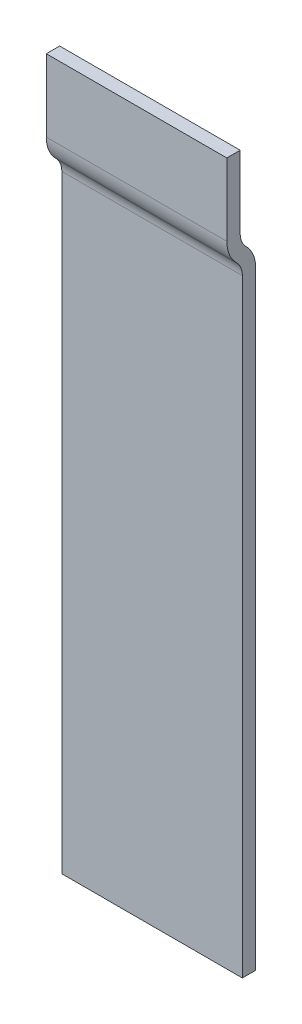
ISO-10303-21;
HEADER;
FILE_DESCRIPTION(('STEP AP214'),'2;1');
FILE_NAME('part.step','',(''),(''),'','','');
FILE_SCHEMA(('AUTOMOTIVE_DESIGN { 1 0 10303 214 1 1 1 1 }'));
ENDSEC;
DATA;
#1=APPLICATION_CONTEXT('core data for automotive mechanical design processes');
#2=APPLICATION_PROTOCOL_DEFINITION('international standard','automotive_design',2000,#1);
#3=PRODUCT_CONTEXT('',#1,'mechanical');
#4=PRODUCT('Part','Part','',(#3));
#5=PRODUCT_RELATED_PRODUCT_CATEGORY('part','',(#4));
#6=PRODUCT_DEFINITION_FORMATION('','',#4);
#7=PRODUCT_DEFINITION_CONTEXT('part definition',#1,'design');
#8=PRODUCT_DEFINITION('design','',#6,#7);
#9=PRODUCT_DEFINITION_SHAPE('','',#8);
#10=(LENGTH_UNIT() NAMED_UNIT(*) SI_UNIT(.MILLI.,.METRE.));
#11=(NAMED_UNIT(*) PLANE_ANGLE_UNIT() SI_UNIT($,.RADIAN.));
#12=(NAMED_UNIT(*) SI_UNIT($,.STERADIAN.) SOLID_ANGLE_UNIT());
#13=UNCERTAINTY_MEASURE_WITH_UNIT(LENGTH_MEASURE(1.E-05),#10,'distance_accuracy_value','');
#14=(GEOMETRIC_REPRESENTATION_CONTEXT(3) GLOBAL_UNCERTAINTY_ASSIGNED_CONTEXT((#13)) GLOBAL_UNIT_ASSIGNED_CONTEXT((#10,
#11,#12)) REPRESENTATION_CONTEXT('',''));
#15=CARTESIAN_POINT('',(0.,0.,0.));
#16=DIRECTION('',(0.,0.,1.));
#17=DIRECTION('',(1.,0.,0.));
#18=AXIS2_PLACEMENT_3D('',#15,#16,#17);
#19=CARTESIAN_POINT('',(2.5,19.8850594954466,0.430000000000005));
#20=DIRECTION('',(0.,0.,1.));
#21=DIRECTION('',(0.,-1.,0.));
#22=AXIS2_PLACEMENT_3D('',#19,#20,#21);
#23=PLANE('',#22);
#24=DIRECTION('',(0.,1.,0.));
#25=VECTOR('',#24,1.);
#26=CARTESIAN_POINT('',(2.5,19.8850594954466,0.430000000000005));
#27=LINE('',#26,#25);
#28=CARTESIAN_POINT('',(2.5,17.8850594954466,0.430000000000005));
#29=VERTEX_POINT('',#28);
#30=CARTESIAN_POINT('',(2.5,19.8850594954466,0.430000000000005));
#31=VERTEX_POINT('',#30);
#32=EDGE_CURVE('E251',#29,#31,#27,.T.);
#33=ORIENTED_EDGE('',*,*,#32,.F.);
#34=DIRECTION('',(-1.,0.,0.));
#35=VECTOR('',#34,1.);
#36=CARTESIAN_POINT('',(2.5,17.8850594954466,0.430000000000005));
#37=LINE('',#36,#35);
#38=CARTESIAN_POINT('',(-2.5,17.8850594954466,0.430000000000005));
#39=VERTEX_POINT('',#38);
#40=EDGE_CURVE('E13',#29,#39,#37,.T.);
#41=ORIENTED_EDGE('',*,*,#40,.T.);
#42=DIRECTION('',(0.,1.,0.));
#43=VECTOR('',#42,1.);
#44=CARTESIAN_POINT('',(-2.5,19.8850594954466,0.430000000000005));
#45=LINE('',#44,#43);
#46=CARTESIAN_POINT('',(-2.5,19.8850594954466,0.430000000000005));
#47=VERTEX_POINT('',#46);
#48=EDGE_CURVE('E161',#39,#47,#45,.T.);
#49=ORIENTED_EDGE('',*,*,#48,.T.);
#50=DIRECTION('',(-1.,0.,0.));
#51=VECTOR('',#50,1.);
#52=CARTESIAN_POINT('',(2.5,19.8850594954466,0.430000000000005));
#53=LINE('',#52,#51);
#54=EDGE_CURVE('E303',#31,#47,#53,.T.);
#55=ORIENTED_EDGE('',*,*,#54,.F.);
#56=EDGE_LOOP('',(#33,#41,#49,#55));
#57=FACE_BOUND('',#56,.T.);
#58=ADVANCED_FACE('F151',(#57),#23,.F.);
#59=CARTESIAN_POINT('',(2.5,19.8850594954466,0.800000000000007));
#60=DIRECTION('',(0.,0.,-1.));
#61=DIRECTION('',(0.,1.,0.));
#62=AXIS2_PLACEMENT_3D('',#59,#60,#61);
#63=PLANE('',#62);
#64=DIRECTION('',(0.,-1.,0.));
#65=VECTOR('',#64,1.);
#66=CARTESIAN_POINT('',(-2.5,19.8850594954466,0.800000000000007));
#67=LINE('',#66,#65);
#68=CARTESIAN_POINT('',(-2.5,19.8850594954466,0.800000000000004));
#69=VERTEX_POINT('',#68);
#70=CARTESIAN_POINT('',(-2.5,17.8850594954466,0.800000000000007));
#71=VERTEX_POINT('',#70);
#72=EDGE_CURVE('E242',#69,#71,#67,.T.);
#73=ORIENTED_EDGE('',*,*,#72,.T.);
#74=DIRECTION('',(1.,0.,0.));
#75=VECTOR('',#74,1.);
#76=CARTESIAN_POINT('',(2.5,17.8850594954466,0.800000000000007));
#77=LINE('',#76,#75);
#78=CARTESIAN_POINT('',(2.5,17.8850594954466,0.800000000000007));
#79=VERTEX_POINT('',#78);
#80=EDGE_CURVE('E225',#71,#79,#77,.T.);
#81=ORIENTED_EDGE('',*,*,#80,.T.);
#82=DIRECTION('',(0.,-1.,0.));
#83=VECTOR('',#82,1.);
#84=CARTESIAN_POINT('',(2.5,19.8850594954466,0.800000000000007));
#85=LINE('',#84,#83);
#86=CARTESIAN_POINT('',(2.5,19.8850594954466,0.800000000000004));
#87=VERTEX_POINT('',#86);
#88=EDGE_CURVE('E230',#87,#79,#85,.T.);
#89=ORIENTED_EDGE('',*,*,#88,.F.);
#90=DIRECTION('',(-1.,0.,0.));
#91=VECTOR('',#90,1.);
#92=CARTESIAN_POINT('',(2.5,19.8850594954466,0.800000000000007));
#93=LINE('',#92,#91);
#94=EDGE_CURVE('E222',#87,#69,#93,.T.);
#95=ORIENTED_EDGE('',*,*,#94,.T.);
#96=EDGE_LOOP('',(#73,#81,#89,#95));
#97=FACE_BOUND('',#96,.T.);
#98=ADVANCED_FACE('F323',(#97),#63,.F.);
#99=CARTESIAN_POINT('',(2.5,8.88300178976817,8.88300178976817));
#100=DIRECTION('',(1.,0.,0.));
#101=DIRECTION('',(0.,0.,-1.));
#102=AXIS2_PLACEMENT_3D('',#99,#100,#101);
#103=PLANE('',#102);
#104=CARTESIAN_POINT('',(2.5,17.8850594954466,-0.11905591591021));
#105=DIRECTION('',(1.,0.,0.));
#106=DIRECTION('',(0.,0.,-1.));
#107=AXIS2_PLACEMENT_3D('',#104,#105,#106);
#108=CIRCLE('',#107,0.549055915910214);
#109=CARTESIAN_POINT('',(2.5,17.4968183340559,0.269185245480492));
#110=VERTEX_POINT('',#109);
#111=EDGE_CURVE('E169',#110,#29,#108,.F.);
#112=ORIENTED_EDGE('',*,*,#111,.T.);
#113=ORIENTED_EDGE('',*,*,#32,.T.);
#114=DIRECTION('',(0.,0.,1.));
#115=VECTOR('',#114,1.);
#116=CARTESIAN_POINT('',(2.5,19.8850594954466,0.800000000000007));
#117=LINE('',#116,#115);
#118=EDGE_CURVE('E237',#31,#87,#117,.T.);
#119=ORIENTED_EDGE('',*,*,#118,.T.);
#120=ORIENTED_EDGE('',*,*,#88,.T.);
#121=CARTESIAN_POINT('',(2.5,17.8850594954466,-0.11905591591021));
#122=DIRECTION('',(1.,0.,0.));
#123=DIRECTION('',(0.,0.,-1.));
#124=AXIS2_PLACEMENT_3D('',#121,#122,#123);
#125=CIRCLE('',#124,0.919055915910217);
#126=CARTESIAN_POINT('',(2.5,17.2351888250169,0.530814754519514));
#127=VERTEX_POINT('',#126);
#128=EDGE_CURVE('E217',#79,#127,#125,.T.);
#129=ORIENTED_EDGE('',*,*,#128,.T.);
#130=CARTESIAN_POINT('',(2.5,16.8469476636262,0.919055915910211));
#131=DIRECTION('',(-1.,0.,0.));
#132=DIRECTION('',(0.,0.,-1.));
#133=AXIS2_PLACEMENT_3D('',#130,#131,#132);
#134=CIRCLE('',#133,0.549055915910209);
#135=CARTESIAN_POINT('',(2.5,16.8469476636262,0.370000000000002));
#136=VERTEX_POINT('',#135);
#137=EDGE_CURVE('E218',#127,#136,#134,.T.);
#138=ORIENTED_EDGE('',*,*,#137,.T.);
#139=DIRECTION('',(0.,-1.,0.));
#140=VECTOR('',#139,1.);
#141=CARTESIAN_POINT('',(2.5,20.,0.370000000000002));
#142=LINE('',#141,#140);
#143=CARTESIAN_POINT('',(2.5,0.,0.369999999999997));
#144=VERTEX_POINT('',#143);
#145=EDGE_CURVE('E254',#136,#144,#142,.T.);
#146=ORIENTED_EDGE('',*,*,#145,.T.);
#147=DIRECTION('',(0.,0.,-1.));
#148=VECTOR('',#147,1.);
#149=CARTESIAN_POINT('',(2.5,0.,0.37));
#150=LINE('',#149,#148);
#151=CARTESIAN_POINT('',(2.5,0.,0.));
#152=VERTEX_POINT('',#151);
#153=EDGE_CURVE('E250',#144,#152,#150,.T.);
#154=ORIENTED_EDGE('',*,*,#153,.T.);
#155=DIRECTION('',(0.,1.,0.));
#156=VECTOR('',#155,1.);
#157=CARTESIAN_POINT('',(2.5,20.,0.));
#158=LINE('',#157,#156);
#159=CARTESIAN_POINT('',(2.5,16.8469476636262,0.));
#160=VERTEX_POINT('',#159);
#161=EDGE_CURVE('E216',#152,#160,#158,.T.);
#162=ORIENTED_EDGE('',*,*,#161,.T.);
#163=CARTESIAN_POINT('',(2.5,16.8469476636262,0.919055915910211));
#164=DIRECTION('',(1.,0.,0.));
#165=DIRECTION('',(0.,0.,-1.));
#166=AXIS2_PLACEMENT_3D('',#163,#164,#165);
#167=CIRCLE('',#166,0.91905591591021);
#168=EDGE_CURVE('E206',#160,#110,#167,.T.);
#169=ORIENTED_EDGE('',*,*,#168,.T.);
#170=EDGE_LOOP('',(#112,#113,#119,#120,#129,#138,#146,#154,#162,#169));
#171=FACE_BOUND('',#170,.T.);
#172=ADVANCED_FACE('F213',(#171),#103,.T.);
#173=CARTESIAN_POINT('',(-2.5,-0.114940504553403,0.430000000000005));
#174=DIRECTION('',(1.,0.,0.));
#175=DIRECTION('',(0.,0.,-1.));
#176=AXIS2_PLACEMENT_3D('',#173,#174,#175);
#177=PLANE('',#176);
#178=ORIENTED_EDGE('',*,*,#48,.F.);
#179=CARTESIAN_POINT('',(-2.5,17.8850594954466,-0.11905591591021));
#180=DIRECTION('',(1.,0.,0.));
#181=DIRECTION('',(0.,0.,-1.));
#182=AXIS2_PLACEMENT_3D('',#179,#180,#181);
#183=CIRCLE('',#182,0.549055915910214);
#184=CARTESIAN_POINT('',(-2.5,17.4968183340559,0.269185245480492));
#185=VERTEX_POINT('',#184);
#186=EDGE_CURVE('E155',#185,#39,#183,.F.);
#187=ORIENTED_EDGE('',*,*,#186,.F.);
#188=CARTESIAN_POINT('',(-2.5,16.8469476636262,0.919055915910211));
#189=DIRECTION('',(1.,0.,0.));
#190=DIRECTION('',(0.,0.,-1.));
#191=AXIS2_PLACEMENT_3D('',#188,#189,#190);
#192=CIRCLE('',#191,0.91905591591021);
#193=CARTESIAN_POINT('',(-2.5,16.8469476636262,0.));
#194=VERTEX_POINT('',#193);
#195=EDGE_CURVE('E208',#194,#185,#192,.T.);
#196=ORIENTED_EDGE('',*,*,#195,.F.);
#197=DIRECTION('',(0.,1.,0.));
#198=VECTOR('',#197,1.);
#199=CARTESIAN_POINT('',(-2.5,20.,0.));
#200=LINE('',#199,#198);
#201=CARTESIAN_POINT('',(-2.5,0.,0.));
#202=VERTEX_POINT('',#201);
#203=EDGE_CURVE('E293',#202,#194,#200,.T.);
#204=ORIENTED_EDGE('',*,*,#203,.F.);
#205=DIRECTION('',(0.,0.,-1.));
#206=VECTOR('',#205,1.);
#207=CARTESIAN_POINT('',(-2.5,0.,0.37));
#208=LINE('',#207,#206);
#209=CARTESIAN_POINT('',(-2.5,0.,0.369999999999997));
#210=VERTEX_POINT('',#209);
#211=EDGE_CURVE('E278',#210,#202,#208,.T.);
#212=ORIENTED_EDGE('',*,*,#211,.F.);
#213=DIRECTION('',(0.,-1.,0.));
#214=VECTOR('',#213,1.);
#215=CARTESIAN_POINT('',(-2.5,20.,0.370000000000002));
#216=LINE('',#215,#214);
#217=CARTESIAN_POINT('',(-2.5,16.8469476636262,0.370000000000002));
#218=VERTEX_POINT('',#217);
#219=EDGE_CURVE('E273',#218,#210,#216,.T.);
#220=ORIENTED_EDGE('',*,*,#219,.F.);
#221=CARTESIAN_POINT('',(-2.5,16.8469476636262,0.919055915910211));
#222=DIRECTION('',(-1.,0.,0.));
#223=DIRECTION('',(0.,0.,-1.));
#224=AXIS2_PLACEMENT_3D('',#221,#222,#223);
#225=CIRCLE('',#224,0.549055915910209);
#226=CARTESIAN_POINT('',(-2.5,17.2351888250169,0.530814754519514));
#227=VERTEX_POINT('',#226);
#228=EDGE_CURVE('E267',#227,#218,#225,.T.);
#229=ORIENTED_EDGE('',*,*,#228,.F.);
#230=CARTESIAN_POINT('',(-2.5,17.8850594954466,-0.11905591591021));
#231=DIRECTION('',(1.,0.,0.));
#232=DIRECTION('',(0.,0.,-1.));
#233=AXIS2_PLACEMENT_3D('',#230,#231,#232);
#234=CIRCLE('',#233,0.919055915910217);
#235=EDGE_CURVE('E232',#71,#227,#234,.T.);
#236=ORIENTED_EDGE('',*,*,#235,.F.);
#237=ORIENTED_EDGE('',*,*,#72,.F.);
#238=DIRECTION('',(0.,0.,1.));
#239=VECTOR('',#238,1.);
#240=CARTESIAN_POINT('',(-2.5,19.8850594954466,0.800000000000007));
#241=LINE('',#240,#239);
#242=EDGE_CURVE('E298',#47,#69,#241,.T.);
#243=ORIENTED_EDGE('',*,*,#242,.F.);
#244=EDGE_LOOP('',(#178,#187,#196,#204,#212,#220,#229,#236,#237,#243));
#245=FACE_BOUND('',#244,.T.);
#246=ADVANCED_FACE('F358',(#245),#177,.F.);
#247=CARTESIAN_POINT('',(-2.50000000050932,17.8850594954466,-0.11905591591021));
#248=DIRECTION('',(1.,0.,0.));
#249=DIRECTION('',(0.,0.707106781186546,0.707106781186549));
#250=AXIS2_PLACEMENT_3D('',#247,#248,#249);
#251=CYLINDRICAL_SURFACE('',#250,0.919055915910217);
#252=ORIENTED_EDGE('',*,*,#80,.F.);
#253=ORIENTED_EDGE('',*,*,#235,.T.);
#254=DIRECTION('',(1.,0.,0.));
#255=VECTOR('',#254,1.);
#256=CARTESIAN_POINT('',(2.5,17.2351888250169,0.530814754519514));
#257=LINE('',#256,#255);
#258=EDGE_CURVE('E210',#227,#127,#257,.T.);
#259=ORIENTED_EDGE('',*,*,#258,.T.);
#260=ORIENTED_EDGE('',*,*,#128,.F.);
#261=EDGE_LOOP('',(#252,#253,#259,#260));
#262=FACE_BOUND('',#261,.T.);
#263=ADVANCED_FACE('F325',(#262),#251,.T.);
#264=CARTESIAN_POINT('',(-2.50000000050932,17.8850594954466,-0.11905591591021));
#265=DIRECTION('',(1.,0.,0.));
#266=DIRECTION('',(0.,0.707106781186546,0.707106781186549));
#267=AXIS2_PLACEMENT_3D('',#264,#265,#266);
#268=CYLINDRICAL_SURFACE('',#267,0.549055915910214);
#269=ORIENTED_EDGE('',*,*,#40,.F.);
#270=ORIENTED_EDGE('',*,*,#111,.F.);
#271=DIRECTION('',(-1.,0.,0.));
#272=VECTOR('',#271,1.);
#273=CARTESIAN_POINT('',(2.5,17.4968183340559,0.269185245480492));
#274=LINE('',#273,#272);
#275=EDGE_CURVE('E202',#110,#185,#274,.T.);
#276=ORIENTED_EDGE('',*,*,#275,.T.);
#277=ORIENTED_EDGE('',*,*,#186,.T.);
#278=EDGE_LOOP('',(#269,#270,#276,#277));
#279=FACE_BOUND('',#278,.T.);
#280=ADVANCED_FACE('F220',(#279),#268,.F.);
#281=CARTESIAN_POINT('',(-2.50000000050932,16.8469476636262,0.919055915910211));
#282=DIRECTION('',(1.,0.,0.));
#283=DIRECTION('',(0.,1.,0.));
#284=AXIS2_PLACEMENT_3D('',#281,#282,#283);
#285=CYLINDRICAL_SURFACE('',#284,0.91905591591021);
#286=ORIENTED_EDGE('',*,*,#275,.F.);
#287=ORIENTED_EDGE('',*,*,#168,.F.);
#288=DIRECTION('',(-1.,0.,0.));
#289=VECTOR('',#288,1.);
#290=CARTESIAN_POINT('',(2.5,16.8469476636262,0.));
#291=LINE('',#290,#289);
#292=EDGE_CURVE('E262',#160,#194,#291,.T.);
#293=ORIENTED_EDGE('',*,*,#292,.T.);
#294=ORIENTED_EDGE('',*,*,#195,.T.);
#295=EDGE_LOOP('',(#286,#287,#293,#294));
#296=FACE_BOUND('',#295,.T.);
#297=ADVANCED_FACE('F203',(#296),#285,.T.);
#298=CARTESIAN_POINT('',(-2.50000000050932,16.8469476636262,0.919055915910211));
#299=DIRECTION('',(1.,0.,0.));
#300=DIRECTION('',(0.,1.,0.));
#301=AXIS2_PLACEMENT_3D('',#298,#299,#300);
#302=CYLINDRICAL_SURFACE('',#301,0.549055915910209);
#303=ORIENTED_EDGE('',*,*,#258,.F.);
#304=ORIENTED_EDGE('',*,*,#228,.T.);
#305=DIRECTION('',(1.,0.,0.));
#306=VECTOR('',#305,1.);
#307=CARTESIAN_POINT('',(2.5,16.8469476636262,0.370000000000002));
#308=LINE('',#307,#306);
#309=EDGE_CURVE('E270',#218,#136,#308,.T.);
#310=ORIENTED_EDGE('',*,*,#309,.T.);
#311=ORIENTED_EDGE('',*,*,#137,.F.);
#312=EDGE_LOOP('',(#303,#304,#310,#311));
#313=FACE_BOUND('',#312,.T.);
#314=ADVANCED_FACE('F333',(#313),#302,.F.);
#315=CARTESIAN_POINT('',(2.5,20.,0.370000000000002));
#316=DIRECTION('',(0.,0.,-1.));
#317=DIRECTION('',(0.,1.,0.));
#318=AXIS2_PLACEMENT_3D('',#315,#316,#317);
#319=PLANE('',#318);
#320=ORIENTED_EDGE('',*,*,#309,.F.);
#321=ORIENTED_EDGE('',*,*,#219,.T.);
#322=DIRECTION('',(-1.,0.,0.));
#323=VECTOR('',#322,1.);
#324=CARTESIAN_POINT('',(2.5,0.,0.37));
#325=LINE('',#324,#323);
#326=EDGE_CURVE('E283',#144,#210,#325,.T.);
#327=ORIENTED_EDGE('',*,*,#326,.F.);
#328=ORIENTED_EDGE('',*,*,#145,.F.);
#329=EDGE_LOOP('',(#320,#321,#327,#328));
#330=FACE_BOUND('',#329,.T.);
#331=ADVANCED_FACE('F337',(#330),#319,.F.);
#332=CARTESIAN_POINT('',(2.5,0.,0.37));
#333=DIRECTION('',(0.,1.,0.));
#334=DIRECTION('',(0.,0.,1.));
#335=AXIS2_PLACEMENT_3D('',#332,#333,#334);
#336=PLANE('',#335);
#337=ORIENTED_EDGE('',*,*,#211,.T.);
#338=DIRECTION('',(-1.,0.,0.));
#339=VECTOR('',#338,1.);
#340=CARTESIAN_POINT('',(2.5,0.,0.));
#341=LINE('',#340,#339);
#342=EDGE_CURVE('E288',#152,#202,#341,.T.);
#343=ORIENTED_EDGE('',*,*,#342,.F.);
#344=ORIENTED_EDGE('',*,*,#153,.F.);
#345=ORIENTED_EDGE('',*,*,#326,.T.);
#346=EDGE_LOOP('',(#337,#343,#344,#345));
#347=FACE_BOUND('',#346,.T.);
#348=ADVANCED_FACE('F360',(#347),#336,.F.);
#349=CARTESIAN_POINT('',(2.5,20.,0.));
#350=DIRECTION('',(0.,0.,1.));
#351=DIRECTION('',(0.,-1.,0.));
#352=AXIS2_PLACEMENT_3D('',#349,#350,#351);
#353=PLANE('',#352);
#354=ORIENTED_EDGE('',*,*,#292,.F.);
#355=ORIENTED_EDGE('',*,*,#161,.F.);
#356=ORIENTED_EDGE('',*,*,#342,.T.);
#357=ORIENTED_EDGE('',*,*,#203,.T.);
#358=EDGE_LOOP('',(#354,#355,#356,#357));
#359=FACE_BOUND('',#358,.T.);
#360=ADVANCED_FACE('F362',(#359),#353,.F.);
#361=CARTESIAN_POINT('',(2.5,19.8850594954466,0.800000000000007));
#362=DIRECTION('',(0.,-1.,0.));
#363=DIRECTION('',(0.,0.,-1.));
#364=AXIS2_PLACEMENT_3D('',#361,#362,#363);
#365=PLANE('',#364);
#366=ORIENTED_EDGE('',*,*,#242,.T.);
#367=ORIENTED_EDGE('',*,*,#94,.F.);
#368=ORIENTED_EDGE('',*,*,#118,.F.);
#369=ORIENTED_EDGE('',*,*,#54,.T.);
#370=EDGE_LOOP('',(#366,#367,#368,#369));
#371=FACE_BOUND('',#370,.T.);
#372=ADVANCED_FACE('F153',(#371),#365,.F.);
#373=CLOSED_SHELL('',(#58,#98,#172,#246,#263,#280,#297,#314,#331,#348,#360,#372));
#374=MANIFOLD_SOLID_BREP('B2',#373);
#375=ADVANCED_BREP_SHAPE_REPRESENTATION('',(#18,#374),#14);
#376=SHAPE_DEFINITION_REPRESENTATION(#9,#375);
ENDSEC;
END-ISO-10303-21;
